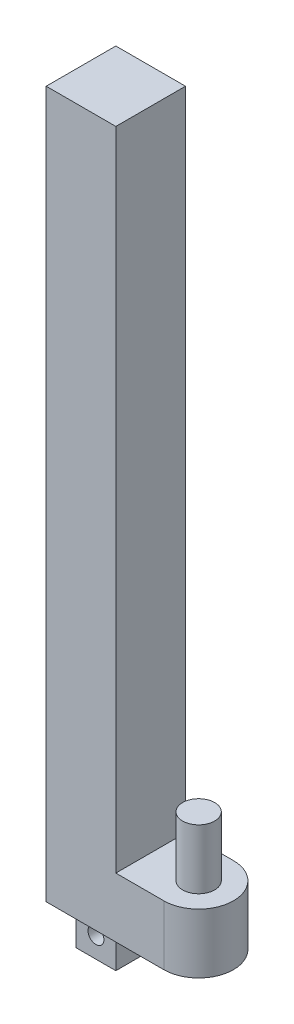
ISO-10303-21;
HEADER;
FILE_DESCRIPTION(('STEP AP214'),'2;1');
FILE_NAME('part.step','',(''),(''),'','','');
FILE_SCHEMA(('AUTOMOTIVE_DESIGN { 1 0 10303 214 1 1 1 1 }'));
ENDSEC;
DATA;
#1=APPLICATION_CONTEXT('core data for automotive mechanical design processes');
#2=APPLICATION_PROTOCOL_DEFINITION('international standard','automotive_design',2000,#1);
#3=PRODUCT_CONTEXT('',#1,'mechanical');
#4=PRODUCT('Part','Part','',(#3));
#5=PRODUCT_RELATED_PRODUCT_CATEGORY('part','',(#4));
#6=PRODUCT_DEFINITION_FORMATION('','',#4);
#7=PRODUCT_DEFINITION_CONTEXT('part definition',#1,'design');
#8=PRODUCT_DEFINITION('design','',#6,#7);
#9=PRODUCT_DEFINITION_SHAPE('','',#8);
#10=(LENGTH_UNIT() NAMED_UNIT(*) SI_UNIT(.MILLI.,.METRE.));
#11=(NAMED_UNIT(*) PLANE_ANGLE_UNIT() SI_UNIT($,.RADIAN.));
#12=(NAMED_UNIT(*) SI_UNIT($,.STERADIAN.) SOLID_ANGLE_UNIT());
#13=UNCERTAINTY_MEASURE_WITH_UNIT(LENGTH_MEASURE(1.E-05),#10,'distance_accuracy_value','');
#14=(GEOMETRIC_REPRESENTATION_CONTEXT(3) GLOBAL_UNCERTAINTY_ASSIGNED_CONTEXT((#13)) GLOBAL_UNIT_ASSIGNED_CONTEXT((#10,
#11,#12)) REPRESENTATION_CONTEXT('',''));
#15=CARTESIAN_POINT('',(0.,0.,0.));
#16=DIRECTION('',(0.,0.,1.));
#17=DIRECTION('',(1.,0.,0.));
#18=AXIS2_PLACEMENT_3D('',#15,#16,#17);
#19=CARTESIAN_POINT('',(0.,0.,0.));
#20=DIRECTION('',(0.,1.,0.));
#21=DIRECTION('',(0.,0.,1.));
#22=AXIS2_PLACEMENT_3D('',#19,#20,#21);
#23=PLANE('',#22);
#24=DIRECTION('',(1.,0.,0.));
#25=VECTOR('',#24,1.);
#26=CARTESIAN_POINT('',(0.,0.,17.5));
#27=LINE('',#26,#25);
#28=CARTESIAN_POINT('',(-17.5,0.,17.5));
#29=VERTEX_POINT('',#28);
#30=CARTESIAN_POINT('',(41.6262977164927,0.,17.5));
#31=VERTEX_POINT('',#30);
#32=EDGE_CURVE('E162',#29,#31,#27,.T.);
#33=ORIENTED_EDGE('',*,*,#32,.F.);
#34=DIRECTION('',(0.,0.,-1.));
#35=VECTOR('',#34,1.);
#36=CARTESIAN_POINT('',(-17.5,0.,0.));
#37=LINE('',#36,#35);
#38=CARTESIAN_POINT('',(-17.5,0.,-17.5));
#39=VERTEX_POINT('',#38);
#40=EDGE_CURVE('E167',#29,#39,#37,.T.);
#41=ORIENTED_EDGE('',*,*,#40,.T.);
#42=DIRECTION('',(1.,0.,0.));
#43=VECTOR('',#42,1.);
#44=CARTESIAN_POINT('',(0.,0.,-17.5));
#45=LINE('',#44,#43);
#46=CARTESIAN_POINT('',(41.6262977164927,0.,-17.5));
#47=VERTEX_POINT('',#46);
#48=EDGE_CURVE('E177',#39,#47,#45,.T.);
#49=ORIENTED_EDGE('',*,*,#48,.T.);
#50=CARTESIAN_POINT('',(41.6262977164927,0.,0.));
#51=DIRECTION('',(0.,1.,0.));
#52=DIRECTION('',(0.,0.,1.));
#53=AXIS2_PLACEMENT_3D('',#50,#51,#52);
#54=CIRCLE('',#53,17.5);
#55=EDGE_CURVE('E134',#47,#31,#54,.F.);
#56=ORIENTED_EDGE('',*,*,#55,.T.);
#57=EDGE_LOOP('',(#33,#41,#49,#56));
#58=FACE_BOUND('',#57,.T.);
#59=DIRECTION('',(0.,0.,1.));
#60=VECTOR('',#59,1.);
#61=CARTESIAN_POINT('',(10.,0.,10.));
#62=LINE('',#61,#60);
#63=CARTESIAN_POINT('',(10.,0.,-10.));
#64=VERTEX_POINT('',#63);
#65=CARTESIAN_POINT('',(10.,0.,10.));
#66=VERTEX_POINT('',#65);
#67=EDGE_CURVE('E130',#64,#66,#62,.T.);
#68=ORIENTED_EDGE('',*,*,#67,.F.);
#69=DIRECTION('',(1.,0.,0.));
#70=VECTOR('',#69,1.);
#71=CARTESIAN_POINT('',(-10.,0.,-10.));
#72=LINE('',#71,#70);
#73=CARTESIAN_POINT('',(-10.,0.,-10.));
#74=VERTEX_POINT('',#73);
#75=EDGE_CURVE('E127',#74,#64,#72,.T.);
#76=ORIENTED_EDGE('',*,*,#75,.F.);
#77=DIRECTION('',(0.,0.,-1.));
#78=VECTOR('',#77,1.);
#79=CARTESIAN_POINT('',(-10.,0.,10.));
#80=LINE('',#79,#78);
#81=CARTESIAN_POINT('',(-10.,0.,10.));
#82=VERTEX_POINT('',#81);
#83=EDGE_CURVE('E53',#82,#74,#80,.T.);
#84=ORIENTED_EDGE('',*,*,#83,.F.);
#85=DIRECTION('',(-1.,0.,0.));
#86=VECTOR('',#85,1.);
#87=CARTESIAN_POINT('',(-10.,0.,10.));
#88=LINE('',#87,#86);
#89=EDGE_CURVE('E48',#66,#82,#88,.T.);
#90=ORIENTED_EDGE('',*,*,#89,.F.);
#91=EDGE_LOOP('',(#68,#76,#84,#90));
#92=FACE_BOUND('',#91,.T.);
#93=ADVANCED_FACE('F33',(#58,#92),#23,.F.);
#94=CARTESIAN_POINT('',(0.,355.,17.5));
#95=DIRECTION('',(0.,0.,-1.));
#96=DIRECTION('',(-1.,0.,0.));
#97=AXIS2_PLACEMENT_3D('',#94,#95,#96);
#98=PLANE('',#97);
#99=ORIENTED_EDGE('',*,*,#32,.T.);
#100=DIRECTION('',(0.,-1.,0.));
#101=VECTOR('',#100,1.);
#102=CARTESIAN_POINT('',(41.6262977164927,30.,17.5));
#103=LINE('',#102,#101);
#104=CARTESIAN_POINT('',(41.6262977164927,30.,17.5));
#105=VERTEX_POINT('',#104);
#106=EDGE_CURVE('E154',#105,#31,#103,.T.);
#107=ORIENTED_EDGE('',*,*,#106,.F.);
#108=DIRECTION('',(1.,0.,0.));
#109=VECTOR('',#108,1.);
#110=CARTESIAN_POINT('',(0.,30.,17.5));
#111=LINE('',#110,#109);
#112=CARTESIAN_POINT('',(17.5,30.,17.5));
#113=VERTEX_POINT('',#112);
#114=EDGE_CURVE('E152',#113,#105,#111,.T.);
#115=ORIENTED_EDGE('',*,*,#114,.F.);
#116=DIRECTION('',(0.,-1.,0.));
#117=VECTOR('',#116,1.);
#118=CARTESIAN_POINT('',(17.5,355.,17.5));
#119=LINE('',#118,#117);
#120=CARTESIAN_POINT('',(17.5,355.,17.5));
#121=VERTEX_POINT('',#120);
#122=EDGE_CURVE('E11',#121,#113,#119,.T.);
#123=ORIENTED_EDGE('',*,*,#122,.F.);
#124=DIRECTION('',(1.,0.,0.));
#125=VECTOR('',#124,1.);
#126=CARTESIAN_POINT('',(0.,355.,17.5));
#127=LINE('',#126,#125);
#128=CARTESIAN_POINT('',(-17.5,355.,17.5));
#129=VERTEX_POINT('',#128);
#130=EDGE_CURVE('E163',#129,#121,#127,.T.);
#131=ORIENTED_EDGE('',*,*,#130,.F.);
#132=DIRECTION('',(0.,-1.,0.));
#133=VECTOR('',#132,1.);
#134=CARTESIAN_POINT('',(-17.5,355.,17.5));
#135=LINE('',#134,#133);
#136=EDGE_CURVE('E175',#129,#29,#135,.T.);
#137=ORIENTED_EDGE('',*,*,#136,.T.);
#138=EDGE_LOOP('',(#99,#107,#115,#123,#131,#137));
#139=FACE_BOUND('',#138,.T.);
#140=ADVANCED_FACE('F35',(#139),#98,.F.);
#141=CARTESIAN_POINT('',(17.5,355.,0.));
#142=DIRECTION('',(-1.,0.,0.));
#143=DIRECTION('',(0.,0.,1.));
#144=AXIS2_PLACEMENT_3D('',#141,#142,#143);
#145=PLANE('',#144);
#146=ORIENTED_EDGE('',*,*,#122,.T.);
#147=DIRECTION('',(0.,0.,-1.));
#148=VECTOR('',#147,1.);
#149=CARTESIAN_POINT('',(17.5,30.,0.));
#150=LINE('',#149,#148);
#151=CARTESIAN_POINT('',(17.5,30.,-17.5));
#152=VERTEX_POINT('',#151);
#153=EDGE_CURVE('E149',#113,#152,#150,.T.);
#154=ORIENTED_EDGE('',*,*,#153,.T.);
#155=DIRECTION('',(0.,-1.,0.));
#156=VECTOR('',#155,1.);
#157=CARTESIAN_POINT('',(17.5,355.,-17.5));
#158=LINE('',#157,#156);
#159=CARTESIAN_POINT('',(17.5,355.,-17.5));
#160=VERTEX_POINT('',#159);
#161=EDGE_CURVE('E41',#160,#152,#158,.T.);
#162=ORIENTED_EDGE('',*,*,#161,.F.);
#163=DIRECTION('',(0.,0.,-1.));
#164=VECTOR('',#163,1.);
#165=CARTESIAN_POINT('',(17.5,355.,0.));
#166=LINE('',#165,#164);
#167=EDGE_CURVE('E166',#121,#160,#166,.T.);
#168=ORIENTED_EDGE('',*,*,#167,.F.);
#169=EDGE_LOOP('',(#146,#154,#162,#168));
#170=FACE_BOUND('',#169,.T.);
#171=ADVANCED_FACE('F190',(#170),#145,.F.);
#172=CARTESIAN_POINT('',(0.,355.,-17.5));
#173=DIRECTION('',(0.,0.,-1.));
#174=DIRECTION('',(-1.,0.,0.));
#175=AXIS2_PLACEMENT_3D('',#172,#173,#174);
#176=PLANE('',#175);
#177=ORIENTED_EDGE('',*,*,#48,.F.);
#178=DIRECTION('',(0.,-1.,0.));
#179=VECTOR('',#178,1.);
#180=CARTESIAN_POINT('',(-17.5,355.,-17.5));
#181=LINE('',#180,#179);
#182=CARTESIAN_POINT('',(-17.5,355.,-17.5));
#183=VERTEX_POINT('',#182);
#184=EDGE_CURVE('E182',#183,#39,#181,.T.);
#185=ORIENTED_EDGE('',*,*,#184,.F.);
#186=DIRECTION('',(1.,0.,0.));
#187=VECTOR('',#186,1.);
#188=CARTESIAN_POINT('',(0.,355.,-17.5));
#189=LINE('',#188,#187);
#190=EDGE_CURVE('E169',#183,#160,#189,.T.);
#191=ORIENTED_EDGE('',*,*,#190,.T.);
#192=ORIENTED_EDGE('',*,*,#161,.T.);
#193=DIRECTION('',(1.,0.,0.));
#194=VECTOR('',#193,1.);
#195=CARTESIAN_POINT('',(0.,30.,-17.5));
#196=LINE('',#195,#194);
#197=CARTESIAN_POINT('',(41.6262977164927,30.,-17.5));
#198=VERTEX_POINT('',#197);
#199=EDGE_CURVE('E146',#152,#198,#196,.T.);
#200=ORIENTED_EDGE('',*,*,#199,.T.);
#201=DIRECTION('',(0.,-1.,0.));
#202=VECTOR('',#201,1.);
#203=CARTESIAN_POINT('',(41.6262977164927,30.,-17.5));
#204=LINE('',#203,#202);
#205=EDGE_CURVE('E159',#198,#47,#204,.T.);
#206=ORIENTED_EDGE('',*,*,#205,.T.);
#207=EDGE_LOOP('',(#177,#185,#191,#192,#200,#206));
#208=FACE_BOUND('',#207,.T.);
#209=ADVANCED_FACE('F187',(#208),#176,.T.);
#210=CARTESIAN_POINT('',(-17.5,355.,0.));
#211=DIRECTION('',(-1.,0.,0.));
#212=DIRECTION('',(0.,0.,1.));
#213=AXIS2_PLACEMENT_3D('',#210,#211,#212);
#214=PLANE('',#213);
#215=ORIENTED_EDGE('',*,*,#40,.F.);
#216=ORIENTED_EDGE('',*,*,#136,.F.);
#217=DIRECTION('',(0.,0.,-1.));
#218=VECTOR('',#217,1.);
#219=CARTESIAN_POINT('',(-17.5,355.,0.));
#220=LINE('',#219,#218);
#221=EDGE_CURVE('E172',#129,#183,#220,.T.);
#222=ORIENTED_EDGE('',*,*,#221,.T.);
#223=ORIENTED_EDGE('',*,*,#184,.T.);
#224=EDGE_LOOP('',(#215,#216,#222,#223));
#225=FACE_BOUND('',#224,.T.);
#226=ADVANCED_FACE('F204',(#225),#214,.T.);
#227=CARTESIAN_POINT('',(0.,355.,0.));
#228=DIRECTION('',(0.,1.,0.));
#229=DIRECTION('',(0.,0.,1.));
#230=AXIS2_PLACEMENT_3D('',#227,#228,#229);
#231=PLANE('',#230);
#232=ORIENTED_EDGE('',*,*,#130,.T.);
#233=ORIENTED_EDGE('',*,*,#167,.T.);
#234=ORIENTED_EDGE('',*,*,#190,.F.);
#235=ORIENTED_EDGE('',*,*,#221,.F.);
#236=EDGE_LOOP('',(#232,#233,#234,#235));
#237=FACE_BOUND('',#236,.T.);
#238=ADVANCED_FACE('F208',(#237),#231,.T.);
#239=CARTESIAN_POINT('',(41.6262977164927,30.,0.));
#240=DIRECTION('',(0.,-1.,0.));
#241=DIRECTION('',(0.,0.,-1.));
#242=AXIS2_PLACEMENT_3D('',#239,#240,#241);
#243=CYLINDRICAL_SURFACE('',#242,17.5);
#244=ORIENTED_EDGE('',*,*,#55,.F.);
#245=ORIENTED_EDGE('',*,*,#205,.F.);
#246=CARTESIAN_POINT('',(41.6262977164927,30.,0.));
#247=DIRECTION('',(0.,1.,0.));
#248=DIRECTION('',(0.,0.,1.));
#249=AXIS2_PLACEMENT_3D('',#246,#247,#248);
#250=CIRCLE('',#249,17.5);
#251=EDGE_CURVE('E143',#198,#105,#250,.F.);
#252=ORIENTED_EDGE('',*,*,#251,.T.);
#253=ORIENTED_EDGE('',*,*,#106,.T.);
#254=EDGE_LOOP('',(#244,#245,#252,#253));
#255=FACE_BOUND('',#254,.T.);
#256=ADVANCED_FACE('F199',(#255),#243,.T.);
#257=CARTESIAN_POINT('',(0.,30.,0.));
#258=DIRECTION('',(0.,1.,0.));
#259=DIRECTION('',(0.,0.,1.));
#260=AXIS2_PLACEMENT_3D('',#257,#258,#259);
#261=PLANE('',#260);
#262=CARTESIAN_POINT('',(41.6262977164927,30.,0.));
#263=DIRECTION('',(0.,1.,0.));
#264=DIRECTION('',(0.,0.,1.));
#265=AXIS2_PLACEMENT_3D('',#262,#263,#264);
#266=CIRCLE('',#265,8.05761032948428);
#267=CARTESIAN_POINT('',(41.6262977164927,30.,8.05761032948428));
#268=VERTEX_POINT('',#267);
#269=EDGE_CURVE('E140',#268,#268,#266,.T.);
#270=ORIENTED_EDGE('',*,*,#269,.F.);
#271=EDGE_LOOP('',(#270));
#272=FACE_BOUND('',#271,.T.);
#273=ORIENTED_EDGE('',*,*,#251,.F.);
#274=ORIENTED_EDGE('',*,*,#199,.F.);
#275=ORIENTED_EDGE('',*,*,#153,.F.);
#276=ORIENTED_EDGE('',*,*,#114,.T.);
#277=EDGE_LOOP('',(#273,#274,#275,#276));
#278=FACE_BOUND('',#277,.T.);
#279=ADVANCED_FACE('F195',(#272,#278),#261,.T.);
#280=CARTESIAN_POINT('',(0.,60.,0.));
#281=DIRECTION('',(0.,1.,0.));
#282=DIRECTION('',(0.,0.,1.));
#283=AXIS2_PLACEMENT_3D('',#280,#281,#282);
#284=PLANE('',#283);
#285=CARTESIAN_POINT('',(41.6262977164927,60.,0.));
#286=DIRECTION('',(0.,1.,0.));
#287=DIRECTION('',(0.,0.,1.));
#288=AXIS2_PLACEMENT_3D('',#285,#286,#287);
#289=CIRCLE('',#288,8.05761032948428);
#290=CARTESIAN_POINT('',(41.6262977164927,60.,8.05761032948428));
#291=VERTEX_POINT('',#290);
#292=EDGE_CURVE('E131',#291,#291,#289,.T.);
#293=ORIENTED_EDGE('',*,*,#292,.T.);
#294=EDGE_LOOP('',(#293));
#295=FACE_BOUND('',#294,.T.);
#296=ADVANCED_FACE('F248',(#295),#284,.T.);
#297=CARTESIAN_POINT('',(41.6262977164927,60.,0.));
#298=DIRECTION('',(0.,-1.,0.));
#299=DIRECTION('',(0.,0.,-1.));
#300=AXIS2_PLACEMENT_3D('',#297,#298,#299);
#301=CYLINDRICAL_SURFACE('',#300,8.05761032948428);
#302=ORIENTED_EDGE('',*,*,#269,.T.);
#303=EDGE_LOOP('',(#302));
#304=FACE_BOUND('',#303,.T.);
#305=ORIENTED_EDGE('',*,*,#292,.F.);
#306=EDGE_LOOP('',(#305));
#307=FACE_BOUND('',#306,.T.);
#308=ADVANCED_FACE('F256',(#304,#307),#301,.T.);
#309=CARTESIAN_POINT('',(10.,-20.,10.));
#310=DIRECTION('',(-1.,0.,0.));
#311=DIRECTION('',(0.,0.,1.));
#312=AXIS2_PLACEMENT_3D('',#309,#310,#311);
#313=PLANE('',#312);
#314=ORIENTED_EDGE('',*,*,#67,.T.);
#315=DIRECTION('',(0.,1.,0.));
#316=VECTOR('',#315,1.);
#317=CARTESIAN_POINT('',(10.,-20.,10.));
#318=LINE('',#317,#316);
#319=CARTESIAN_POINT('',(10.,-20.,10.));
#320=VERTEX_POINT('',#319);
#321=EDGE_CURVE('E111',#320,#66,#318,.T.);
#322=ORIENTED_EDGE('',*,*,#321,.F.);
#323=DIRECTION('',(0.,0.,1.));
#324=VECTOR('',#323,1.);
#325=CARTESIAN_POINT('',(10.,-20.,10.));
#326=LINE('',#325,#324);
#327=CARTESIAN_POINT('',(10.,-20.,-10.));
#328=VERTEX_POINT('',#327);
#329=EDGE_CURVE('E118',#328,#320,#326,.T.);
#330=ORIENTED_EDGE('',*,*,#329,.F.);
#331=DIRECTION('',(0.,1.,0.));
#332=VECTOR('',#331,1.);
#333=CARTESIAN_POINT('',(10.,-20.,-10.));
#334=LINE('',#333,#332);
#335=EDGE_CURVE('E372',#328,#64,#334,.T.);
#336=ORIENTED_EDGE('',*,*,#335,.T.);
#337=EDGE_LOOP('',(#314,#322,#330,#336));
#338=FACE_BOUND('',#337,.T.);
#339=ADVANCED_FACE('F129',(#338),#313,.F.);
#340=CARTESIAN_POINT('',(-10.,-20.,10.));
#341=DIRECTION('',(0.,0.,-1.));
#342=DIRECTION('',(-1.,0.,0.));
#343=AXIS2_PLACEMENT_3D('',#340,#341,#342);
#344=PLANE('',#343);
#345=CARTESIAN_POINT('',(0.,-9.58323728794625,10.));
#346=DIRECTION('',(0.,0.,1.));
#347=DIRECTION('',(1.,0.,0.));
#348=AXIS2_PLACEMENT_3D('',#345,#346,#347);
#349=CIRCLE('',#348,4.);
#350=CARTESIAN_POINT('',(4.,-9.58323728794625,10.));
#351=VERTEX_POINT('',#350);
#352=EDGE_CURVE('E363',#351,#351,#349,.T.);
#353=ORIENTED_EDGE('',*,*,#352,.F.);
#354=EDGE_LOOP('',(#353));
#355=FACE_BOUND('',#354,.T.);
#356=ORIENTED_EDGE('',*,*,#89,.T.);
#357=DIRECTION('',(0.,1.,0.));
#358=VECTOR('',#357,1.);
#359=CARTESIAN_POINT('',(-10.,-20.,10.));
#360=LINE('',#359,#358);
#361=CARTESIAN_POINT('',(-10.,-20.,10.));
#362=VERTEX_POINT('',#361);
#363=EDGE_CURVE('E114',#362,#82,#360,.T.);
#364=ORIENTED_EDGE('',*,*,#363,.F.);
#365=DIRECTION('',(-1.,0.,0.));
#366=VECTOR('',#365,1.);
#367=CARTESIAN_POINT('',(-10.,-20.,10.));
#368=LINE('',#367,#366);
#369=EDGE_CURVE('E107',#320,#362,#368,.T.);
#370=ORIENTED_EDGE('',*,*,#369,.F.);
#371=ORIENTED_EDGE('',*,*,#321,.T.);
#372=EDGE_LOOP('',(#356,#364,#370,#371));
#373=FACE_BOUND('',#372,.T.);
#374=ADVANCED_FACE('F109',(#355,#373),#344,.F.);
#375=CARTESIAN_POINT('',(-10.,-20.,10.));
#376=DIRECTION('',(1.,0.,0.));
#377=DIRECTION('',(0.,0.,-1.));
#378=AXIS2_PLACEMENT_3D('',#375,#376,#377);
#379=PLANE('',#378);
#380=ORIENTED_EDGE('',*,*,#83,.T.);
#381=DIRECTION('',(0.,1.,0.));
#382=VECTOR('',#381,1.);
#383=CARTESIAN_POINT('',(-10.,-20.,-10.));
#384=LINE('',#383,#382);
#385=CARTESIAN_POINT('',(-10.,-20.,-10.));
#386=VERTEX_POINT('',#385);
#387=EDGE_CURVE('E136',#386,#74,#384,.T.);
#388=ORIENTED_EDGE('',*,*,#387,.F.);
#389=DIRECTION('',(0.,0.,-1.));
#390=VECTOR('',#389,1.);
#391=CARTESIAN_POINT('',(-10.,-20.,10.));
#392=LINE('',#391,#390);
#393=EDGE_CURVE('E117',#362,#386,#392,.T.);
#394=ORIENTED_EDGE('',*,*,#393,.F.);
#395=ORIENTED_EDGE('',*,*,#363,.T.);
#396=EDGE_LOOP('',(#380,#388,#394,#395));
#397=FACE_BOUND('',#396,.T.);
#398=ADVANCED_FACE('F278',(#397),#379,.F.);
#399=CARTESIAN_POINT('',(-10.,-20.,-10.));
#400=DIRECTION('',(0.,0.,1.));
#401=DIRECTION('',(1.,0.,0.));
#402=AXIS2_PLACEMENT_3D('',#399,#400,#401);
#403=PLANE('',#402);
#404=CARTESIAN_POINT('',(0.,-9.58323728794625,-10.));
#405=DIRECTION('',(0.,0.,1.));
#406=DIRECTION('',(1.,0.,0.));
#407=AXIS2_PLACEMENT_3D('',#404,#405,#406);
#408=CIRCLE('',#407,4.);
#409=CARTESIAN_POINT('',(4.,-9.58323728794625,-10.));
#410=VERTEX_POINT('',#409);
#411=EDGE_CURVE('E366',#410,#410,#408,.F.);
#412=ORIENTED_EDGE('',*,*,#411,.F.);
#413=EDGE_LOOP('',(#412));
#414=FACE_BOUND('',#413,.T.);
#415=ORIENTED_EDGE('',*,*,#75,.T.);
#416=ORIENTED_EDGE('',*,*,#335,.F.);
#417=DIRECTION('',(1.,0.,0.));
#418=VECTOR('',#417,1.);
#419=CARTESIAN_POINT('',(-10.,-20.,-10.));
#420=LINE('',#419,#418);
#421=EDGE_CURVE('E123',#386,#328,#420,.T.);
#422=ORIENTED_EDGE('',*,*,#421,.F.);
#423=ORIENTED_EDGE('',*,*,#387,.T.);
#424=EDGE_LOOP('',(#415,#416,#422,#423));
#425=FACE_BOUND('',#424,.T.);
#426=ADVANCED_FACE('F287',(#414,#425),#403,.F.);
#427=CARTESIAN_POINT('',(0.,-20.,0.));
#428=DIRECTION('',(0.,-1.,0.));
#429=DIRECTION('',(0.,0.,-1.));
#430=AXIS2_PLACEMENT_3D('',#427,#428,#429);
#431=PLANE('',#430);
#432=ORIENTED_EDGE('',*,*,#329,.T.);
#433=ORIENTED_EDGE('',*,*,#369,.T.);
#434=ORIENTED_EDGE('',*,*,#393,.T.);
#435=ORIENTED_EDGE('',*,*,#421,.T.);
#436=EDGE_LOOP('',(#432,#433,#434,#435));
#437=FACE_BOUND('',#436,.T.);
#438=ADVANCED_FACE('F121',(#437),#431,.T.);
#439=CARTESIAN_POINT('',(0.,-9.58323728794625,-17.501));
#440=DIRECTION('',(0.,0.,1.));
#441=DIRECTION('',(1.,0.,0.));
#442=AXIS2_PLACEMENT_3D('',#439,#440,#441);
#443=CYLINDRICAL_SURFACE('',#442,4.);
#444=ORIENTED_EDGE('',*,*,#352,.T.);
#445=EDGE_LOOP('',(#444));
#446=FACE_BOUND('',#445,.T.);
#447=ORIENTED_EDGE('',*,*,#411,.T.);
#448=EDGE_LOOP('',(#447));
#449=FACE_BOUND('',#448,.T.);
#450=ADVANCED_FACE('F301',(#446,#449),#443,.F.);
#451=CLOSED_SHELL('',(#93,#140,#171,#209,#226,#238,#256,#279,#296,#308,#339,#374,#398,#426,#438,#450));
#452=MANIFOLD_SOLID_BREP('B2',#451);
#453=ADVANCED_BREP_SHAPE_REPRESENTATION('',(#18,#452),#14);
#454=SHAPE_DEFINITION_REPRESENTATION(#9,#453);
ENDSEC;
END-ISO-10303-21;
